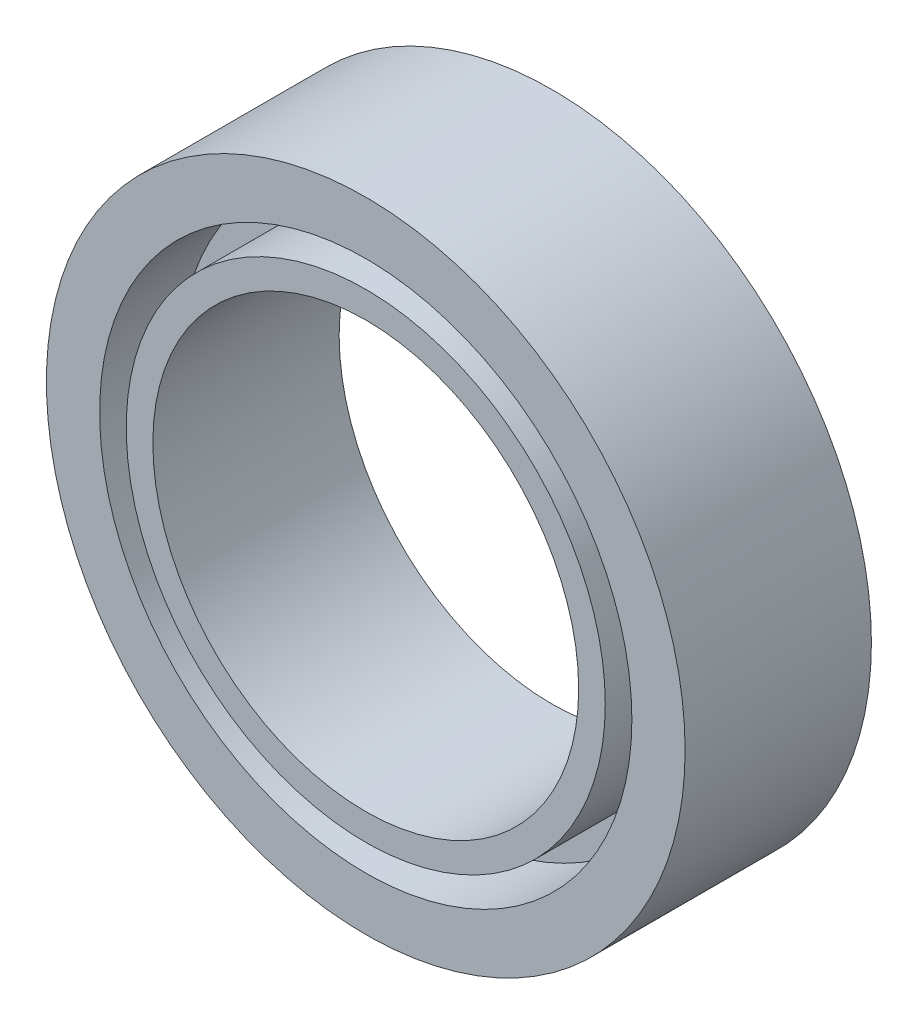
ISO-10303-21;
HEADER;
FILE_DESCRIPTION(('STEP AP214'),'2;1');
FILE_NAME('part.step','',(''),(''),'','','');
FILE_SCHEMA(('AUTOMOTIVE_DESIGN { 1 0 10303 214 1 1 1 1 }'));
ENDSEC;
DATA;
#1=APPLICATION_CONTEXT('core data for automotive mechanical design processes');
#2=APPLICATION_PROTOCOL_DEFINITION('international standard','automotive_design',2000,#1);
#3=PRODUCT_CONTEXT('',#1,'mechanical');
#4=PRODUCT('Part','Part','',(#3));
#5=PRODUCT_RELATED_PRODUCT_CATEGORY('part','',(#4));
#6=PRODUCT_DEFINITION_FORMATION('','',#4);
#7=PRODUCT_DEFINITION_CONTEXT('part definition',#1,'design');
#8=PRODUCT_DEFINITION('design','',#6,#7);
#9=PRODUCT_DEFINITION_SHAPE('','',#8);
#10=(LENGTH_UNIT() NAMED_UNIT(*) SI_UNIT(.MILLI.,.METRE.));
#11=(NAMED_UNIT(*) PLANE_ANGLE_UNIT() SI_UNIT($,.RADIAN.));
#12=(NAMED_UNIT(*) SI_UNIT($,.STERADIAN.) SOLID_ANGLE_UNIT());
#13=UNCERTAINTY_MEASURE_WITH_UNIT(LENGTH_MEASURE(1.E-05),#10,'distance_accuracy_value','');
#14=(GEOMETRIC_REPRESENTATION_CONTEXT(3) GLOBAL_UNCERTAINTY_ASSIGNED_CONTEXT((#13)) GLOBAL_UNIT_ASSIGNED_CONTEXT((#10,
#11,#12)) REPRESENTATION_CONTEXT('',''));
#15=CARTESIAN_POINT('',(0.,0.,0.));
#16=DIRECTION('',(0.,0.,1.));
#17=DIRECTION('',(1.,0.,0.));
#18=AXIS2_PLACEMENT_3D('',#15,#16,#17);
#19=CARTESIAN_POINT('',(0.,0.,0.));
#20=DIRECTION('',(0.,0.,1.));
#21=DIRECTION('',(1.,0.,0.));
#22=AXIS2_PLACEMENT_3D('',#19,#20,#21);
#23=PLANE('',#22);
#24=CARTESIAN_POINT('',(0.,0.,0.));
#25=DIRECTION('',(0.,0.,1.));
#26=DIRECTION('',(1.,0.,0.));
#27=AXIS2_PLACEMENT_3D('',#24,#25,#26);
#28=CIRCLE('',#27,4.);
#29=CARTESIAN_POINT('',(4.,0.,0.));
#30=VERTEX_POINT('',#29);
#31=EDGE_CURVE('E45',#30,#30,#28,.T.);
#32=ORIENTED_EDGE('',*,*,#31,.T.);
#33=EDGE_LOOP('',(#32));
#34=FACE_BOUND('',#33,.T.);
#35=CARTESIAN_POINT('',(0.,0.,0.));
#36=DIRECTION('',(0.,0.,1.));
#37=DIRECTION('',(1.,0.,0.));
#38=AXIS2_PLACEMENT_3D('',#35,#36,#37);
#39=CIRCLE('',#38,4.5);
#40=CARTESIAN_POINT('',(4.5,0.,0.));
#41=VERTEX_POINT('',#40);
#42=EDGE_CURVE('E69',#41,#41,#39,.T.);
#43=ORIENTED_EDGE('',*,*,#42,.F.);
#44=EDGE_LOOP('',(#43));
#45=FACE_BOUND('',#44,.T.);
#46=ADVANCED_FACE('F32',(#34,#45),#23,.F.);
#47=CARTESIAN_POINT('',(0.,0.,3.5));
#48=DIRECTION('',(0.,0.,1.));
#49=DIRECTION('',(1.,0.,0.));
#50=AXIS2_PLACEMENT_3D('',#47,#48,#49);
#51=PLANE('',#50);
#52=CARTESIAN_POINT('',(0.,0.,3.5));
#53=DIRECTION('',(0.,0.,1.));
#54=DIRECTION('',(1.,0.,0.));
#55=AXIS2_PLACEMENT_3D('',#52,#53,#54);
#56=CIRCLE('',#55,4.);
#57=CARTESIAN_POINT('',(4.,0.,3.5));
#58=VERTEX_POINT('',#57);
#59=EDGE_CURVE('E43',#58,#58,#56,.T.);
#60=ORIENTED_EDGE('',*,*,#59,.F.);
#61=EDGE_LOOP('',(#60));
#62=FACE_BOUND('',#61,.T.);
#63=CARTESIAN_POINT('',(0.,0.,3.5));
#64=DIRECTION('',(0.,0.,1.));
#65=DIRECTION('',(1.,0.,0.));
#66=AXIS2_PLACEMENT_3D('',#63,#64,#65);
#67=CIRCLE('',#66,4.5);
#68=CARTESIAN_POINT('',(4.5,0.,3.5));
#69=VERTEX_POINT('',#68);
#70=EDGE_CURVE('E57',#69,#69,#67,.T.);
#71=ORIENTED_EDGE('',*,*,#70,.T.);
#72=EDGE_LOOP('',(#71));
#73=FACE_BOUND('',#72,.T.);
#74=ADVANCED_FACE('F85',(#62,#73),#51,.T.);
#75=CARTESIAN_POINT('',(0.,0.,3.5));
#76=DIRECTION('',(0.,0.,1.));
#77=DIRECTION('',(1.,0.,0.));
#78=AXIS2_PLACEMENT_3D('',#75,#76,#77);
#79=CIRCLE('',#78,5.);
#80=CARTESIAN_POINT('',(5.,0.,3.5));
#81=VERTEX_POINT('',#80);
#82=EDGE_CURVE('E51',#81,#81,#79,.T.);
#83=ORIENTED_EDGE('',*,*,#82,.F.);
#84=EDGE_LOOP('',(#83));
#85=FACE_BOUND('',#84,.T.);
#86=CARTESIAN_POINT('',(0.,0.,3.5));
#87=DIRECTION('',(0.,0.,1.));
#88=DIRECTION('',(1.,0.,0.));
#89=AXIS2_PLACEMENT_3D('',#86,#87,#88);
#90=CIRCLE('',#89,6.);
#91=CARTESIAN_POINT('',(6.,0.,3.5));
#92=VERTEX_POINT('',#91);
#93=EDGE_CURVE('E10',#92,#92,#90,.T.);
#94=ORIENTED_EDGE('',*,*,#93,.T.);
#95=EDGE_LOOP('',(#94));
#96=FACE_BOUND('',#95,.T.);
#97=ADVANCED_FACE('F91',(#85,#96),#51,.T.);
#98=CARTESIAN_POINT('',(0.,0.,0.));
#99=DIRECTION('',(0.,0.,1.));
#100=DIRECTION('',(1.,0.,0.));
#101=AXIS2_PLACEMENT_3D('',#98,#99,#100);
#102=CIRCLE('',#101,5.);
#103=CARTESIAN_POINT('',(5.,0.,0.));
#104=VERTEX_POINT('',#103);
#105=EDGE_CURVE('E63',#104,#104,#102,.T.);
#106=ORIENTED_EDGE('',*,*,#105,.T.);
#107=EDGE_LOOP('',(#106));
#108=FACE_BOUND('',#107,.T.);
#109=CARTESIAN_POINT('',(0.,0.,0.));
#110=DIRECTION('',(0.,0.,1.));
#111=DIRECTION('',(1.,0.,0.));
#112=AXIS2_PLACEMENT_3D('',#109,#110,#111);
#113=CIRCLE('',#112,6.);
#114=CARTESIAN_POINT('',(6.,0.,0.));
#115=VERTEX_POINT('',#114);
#116=EDGE_CURVE('E36',#115,#115,#113,.T.);
#117=ORIENTED_EDGE('',*,*,#116,.F.);
#118=EDGE_LOOP('',(#117));
#119=FACE_BOUND('',#118,.T.);
#120=ADVANCED_FACE('F87',(#108,#119),#23,.F.);
#121=CARTESIAN_POINT('',(0.,0.,3.5));
#122=DIRECTION('',(0.,0.,-1.));
#123=DIRECTION('',(-1.,0.,0.));
#124=AXIS2_PLACEMENT_3D('',#121,#122,#123);
#125=CYLINDRICAL_SURFACE('',#124,6.);
#126=ORIENTED_EDGE('',*,*,#93,.F.);
#127=EDGE_LOOP('',(#126));
#128=FACE_BOUND('',#127,.T.);
#129=ORIENTED_EDGE('',*,*,#116,.T.);
#130=EDGE_LOOP('',(#129));
#131=FACE_BOUND('',#130,.T.);
#132=ADVANCED_FACE('F34',(#128,#131),#125,.T.);
#133=CARTESIAN_POINT('',(0.,0.,3.5));
#134=DIRECTION('',(0.,0.,-1.));
#135=DIRECTION('',(-1.,0.,0.));
#136=AXIS2_PLACEMENT_3D('',#133,#134,#135);
#137=CYLINDRICAL_SURFACE('',#136,4.);
#138=ORIENTED_EDGE('',*,*,#59,.T.);
#139=EDGE_LOOP('',(#138));
#140=FACE_BOUND('',#139,.T.);
#141=ORIENTED_EDGE('',*,*,#31,.F.);
#142=EDGE_LOOP('',(#141));
#143=FACE_BOUND('',#142,.T.);
#144=ADVANCED_FACE('F100',(#140,#143),#137,.F.);
#145=CARTESIAN_POINT('',(0.,0.,2.));
#146=DIRECTION('',(0.,0.,1.));
#147=DIRECTION('',(1.,0.,0.));
#148=AXIS2_PLACEMENT_3D('',#145,#146,#147);
#149=CYLINDRICAL_SURFACE('',#148,5.);
#150=CARTESIAN_POINT('',(0.,0.,2.));
#151=DIRECTION('',(0.,0.,1.));
#152=DIRECTION('',(1.,0.,0.));
#153=AXIS2_PLACEMENT_3D('',#150,#151,#152);
#154=CIRCLE('',#153,5.);
#155=CARTESIAN_POINT('',(5.,0.,2.));
#156=VERTEX_POINT('',#155);
#157=EDGE_CURVE('E48',#156,#156,#154,.T.);
#158=ORIENTED_EDGE('',*,*,#157,.F.);
#159=EDGE_LOOP('',(#158));
#160=FACE_BOUND('',#159,.T.);
#161=ORIENTED_EDGE('',*,*,#82,.T.);
#162=EDGE_LOOP('',(#161));
#163=FACE_BOUND('',#162,.T.);
#164=ADVANCED_FACE('F124',(#160,#163),#149,.F.);
#165=CARTESIAN_POINT('',(0.,0.,2.));
#166=DIRECTION('',(0.,0.,1.));
#167=DIRECTION('',(1.,0.,0.));
#168=AXIS2_PLACEMENT_3D('',#165,#166,#167);
#169=PLANE('',#168);
#170=CARTESIAN_POINT('',(0.,0.,2.));
#171=DIRECTION('',(0.,0.,1.));
#172=DIRECTION('',(1.,0.,0.));
#173=AXIS2_PLACEMENT_3D('',#170,#171,#172);
#174=CIRCLE('',#173,4.5);
#175=CARTESIAN_POINT('',(4.5,0.,2.));
#176=VERTEX_POINT('',#175);
#177=EDGE_CURVE('E54',#176,#176,#174,.T.);
#178=ORIENTED_EDGE('',*,*,#177,.F.);
#179=EDGE_LOOP('',(#178));
#180=FACE_BOUND('',#179,.T.);
#181=ORIENTED_EDGE('',*,*,#157,.T.);
#182=EDGE_LOOP('',(#181));
#183=FACE_BOUND('',#182,.T.);
#184=ADVANCED_FACE('F120',(#180,#183),#169,.T.);
#185=CARTESIAN_POINT('',(0.,0.,2.));
#186=DIRECTION('',(0.,0.,1.));
#187=DIRECTION('',(1.,0.,0.));
#188=AXIS2_PLACEMENT_3D('',#185,#186,#187);
#189=CYLINDRICAL_SURFACE('',#188,4.5);
#190=ORIENTED_EDGE('',*,*,#177,.T.);
#191=EDGE_LOOP('',(#190));
#192=FACE_BOUND('',#191,.T.);
#193=ORIENTED_EDGE('',*,*,#70,.F.);
#194=EDGE_LOOP('',(#193));
#195=FACE_BOUND('',#194,.T.);
#196=ADVANCED_FACE('F114',(#192,#195),#189,.T.);
#197=CARTESIAN_POINT('',(0.,0.,1.5));
#198=DIRECTION('',(0.,0.,-1.));
#199=DIRECTION('',(1.,0.,0.));
#200=AXIS2_PLACEMENT_3D('',#197,#198,#199);
#201=PLANE('',#200);
#202=CARTESIAN_POINT('',(0.,0.,1.5));
#203=DIRECTION('',(0.,0.,1.));
#204=DIRECTION('',(1.,0.,0.));
#205=AXIS2_PLACEMENT_3D('',#202,#203,#204);
#206=CIRCLE('',#205,5.);
#207=CARTESIAN_POINT('',(5.,0.,1.5));
#208=VERTEX_POINT('',#207);
#209=EDGE_CURVE('E60',#208,#208,#206,.T.);
#210=ORIENTED_EDGE('',*,*,#209,.F.);
#211=EDGE_LOOP('',(#210));
#212=FACE_BOUND('',#211,.T.);
#213=CARTESIAN_POINT('',(0.,0.,1.5));
#214=DIRECTION('',(0.,0.,1.));
#215=DIRECTION('',(1.,0.,0.));
#216=AXIS2_PLACEMENT_3D('',#213,#214,#215);
#217=CIRCLE('',#216,4.5);
#218=CARTESIAN_POINT('',(4.5,0.,1.5));
#219=VERTEX_POINT('',#218);
#220=EDGE_CURVE('E66',#219,#219,#217,.T.);
#221=ORIENTED_EDGE('',*,*,#220,.T.);
#222=EDGE_LOOP('',(#221));
#223=FACE_BOUND('',#222,.T.);
#224=ADVANCED_FACE('F75',(#212,#223),#201,.T.);
#225=CARTESIAN_POINT('',(0.,0.,1.5));
#226=DIRECTION('',(0.,0.,-1.));
#227=DIRECTION('',(-1.,0.,0.));
#228=AXIS2_PLACEMENT_3D('',#225,#226,#227);
#229=CYLINDRICAL_SURFACE('',#228,5.);
#230=ORIENTED_EDGE('',*,*,#209,.T.);
#231=EDGE_LOOP('',(#230));
#232=FACE_BOUND('',#231,.T.);
#233=ORIENTED_EDGE('',*,*,#105,.F.);
#234=EDGE_LOOP('',(#233));
#235=FACE_BOUND('',#234,.T.);
#236=ADVANCED_FACE('F80',(#232,#235),#229,.F.);
#237=CARTESIAN_POINT('',(0.,0.,1.5));
#238=DIRECTION('',(0.,0.,-1.));
#239=DIRECTION('',(-1.,0.,0.));
#240=AXIS2_PLACEMENT_3D('',#237,#238,#239);
#241=CYLINDRICAL_SURFACE('',#240,4.5);
#242=ORIENTED_EDGE('',*,*,#220,.F.);
#243=EDGE_LOOP('',(#242));
#244=FACE_BOUND('',#243,.T.);
#245=ORIENTED_EDGE('',*,*,#42,.T.);
#246=EDGE_LOOP('',(#245));
#247=FACE_BOUND('',#246,.T.);
#248=ADVANCED_FACE('F77',(#244,#247),#241,.T.);
#249=CLOSED_SHELL('',(#46,#74,#97,#120,#132,#144,#164,#184,#196,#224,#236,#248));
#250=MANIFOLD_SOLID_BREP('B2',#249);
#251=ADVANCED_BREP_SHAPE_REPRESENTATION('',(#18,#250),#14);
#252=SHAPE_DEFINITION_REPRESENTATION(#9,#251);
ENDSEC;
END-ISO-10303-21;
